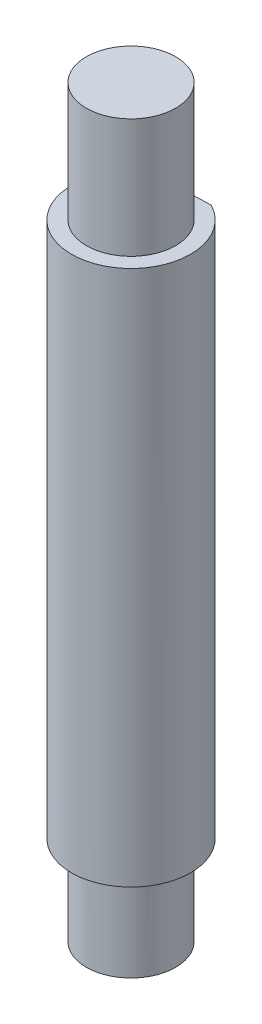
ISO-10303-21;
HEADER;
FILE_DESCRIPTION(('STEP AP214'),'2;1');
FILE_NAME('part.step','',(''),(''),'','','');
FILE_SCHEMA(('AUTOMOTIVE_DESIGN { 1 0 10303 214 1 1 1 1 }'));
ENDSEC;
DATA;
#1=APPLICATION_CONTEXT('core data for automotive mechanical design processes');
#2=APPLICATION_PROTOCOL_DEFINITION('international standard','automotive_design',2000,#1);
#3=PRODUCT_CONTEXT('',#1,'mechanical');
#4=PRODUCT('Part','Part','',(#3));
#5=PRODUCT_RELATED_PRODUCT_CATEGORY('part','',(#4));
#6=PRODUCT_DEFINITION_FORMATION('','',#4);
#7=PRODUCT_DEFINITION_CONTEXT('part definition',#1,'design');
#8=PRODUCT_DEFINITION('design','',#6,#7);
#9=PRODUCT_DEFINITION_SHAPE('','',#8);
#10=(LENGTH_UNIT() NAMED_UNIT(*) SI_UNIT(.MILLI.,.METRE.));
#11=(NAMED_UNIT(*) PLANE_ANGLE_UNIT() SI_UNIT($,.RADIAN.));
#12=(NAMED_UNIT(*) SI_UNIT($,.STERADIAN.) SOLID_ANGLE_UNIT());
#13=UNCERTAINTY_MEASURE_WITH_UNIT(LENGTH_MEASURE(1.E-05),#10,'distance_accuracy_value','');
#14=(GEOMETRIC_REPRESENTATION_CONTEXT(3) GLOBAL_UNCERTAINTY_ASSIGNED_CONTEXT((#13)) GLOBAL_UNIT_ASSIGNED_CONTEXT((#10,
#11,#12)) REPRESENTATION_CONTEXT('',''));
#15=CARTESIAN_POINT('',(0.,0.,0.));
#16=DIRECTION('',(0.,0.,1.));
#17=DIRECTION('',(1.,0.,0.));
#18=AXIS2_PLACEMENT_3D('',#15,#16,#17);
#19=CARTESIAN_POINT('',(0.,18.,0.));
#20=DIRECTION('',(0.,-1.,0.));
#21=DIRECTION('',(0.,0.,-1.));
#22=AXIS2_PLACEMENT_3D('',#19,#20,#21);
#23=PLANE('',#22);
#24=DIRECTION('',(-0.99954088962964,0.,0.0302986791525441));
#25=VECTOR('',#24,1.);
#26=CARTESIAN_POINT('',(0.916253010313562,18.,-1.77777400731683));
#27=LINE('',#26,#25);
#28=CARTESIAN_POINT('',(0.916253010313562,18.,-1.77777400731683));
#29=VERTEX_POINT('',#28);
#30=CARTESIAN_POINT('',(-1.02224970081514,18.,-1.71901295782881));
#31=VERTEX_POINT('',#30);
#32=EDGE_CURVE('E67',#29,#31,#27,.T.);
#33=ORIENTED_EDGE('',*,*,#32,.F.);
#34=CARTESIAN_POINT('',(0.,18.,0.));
#35=DIRECTION('',(0.,-1.,0.));
#36=DIRECTION('',(0.,0.,-1.));
#37=AXIS2_PLACEMENT_3D('',#34,#35,#36);
#38=CIRCLE('',#37,2.);
#39=EDGE_CURVE('E72',#31,#29,#38,.T.);
#40=ORIENTED_EDGE('',*,*,#39,.F.);
#41=EDGE_LOOP('',(#33,#40));
#42=FACE_BOUND('',#41,.T.);
#43=ADVANCED_FACE('F35',(#42),#23,.F.);
#44=CARTESIAN_POINT('',(0.,25.,0.));
#45=DIRECTION('',(0.,-1.,0.));
#46=DIRECTION('',(0.,0.,-1.));
#47=AXIS2_PLACEMENT_3D('',#44,#45,#46);
#48=CYLINDRICAL_SURFACE('',#47,1.5);
#49=CARTESIAN_POINT('',(0.,3.,0.));
#50=DIRECTION('',(0.,-1.,0.));
#51=DIRECTION('',(0.,0.,-1.));
#52=AXIS2_PLACEMENT_3D('',#49,#50,#51);
#53=CIRCLE('',#52,1.5);
#54=CARTESIAN_POINT('',(0.,3.,-1.5));
#55=VERTEX_POINT('',#54);
#56=EDGE_CURVE('E69',#55,#55,#53,.T.);
#57=ORIENTED_EDGE('',*,*,#56,.T.);
#58=EDGE_LOOP('',(#57));
#59=FACE_BOUND('',#58,.T.);
#60=CARTESIAN_POINT('',(0.,0.,0.));
#61=DIRECTION('',(0.,1.,0.));
#62=DIRECTION('',(0.,0.,1.));
#63=AXIS2_PLACEMENT_3D('',#60,#61,#62);
#64=CIRCLE('',#63,1.5);
#65=CARTESIAN_POINT('',(0.,0.,1.5));
#66=VERTEX_POINT('',#65);
#67=EDGE_CURVE('E39',#66,#66,#64,.T.);
#68=ORIENTED_EDGE('',*,*,#67,.T.);
#69=EDGE_LOOP('',(#68));
#70=FACE_BOUND('',#69,.T.);
#71=ADVANCED_FACE('F37',(#59,#70),#48,.T.);
#72=CARTESIAN_POINT('',(0.,0.,0.));
#73=DIRECTION('',(0.,1.,0.));
#74=DIRECTION('',(0.,0.,1.));
#75=AXIS2_PLACEMENT_3D('',#72,#73,#74);
#76=PLANE('',#75);
#77=ORIENTED_EDGE('',*,*,#67,.F.);
#78=EDGE_LOOP('',(#77));
#79=FACE_BOUND('',#78,.T.);
#80=ADVANCED_FACE('F110',(#79),#76,.F.);
#81=CARTESIAN_POINT('',(0.,3.,0.));
#82=DIRECTION('',(0.,-1.,0.));
#83=DIRECTION('',(0.,0.,-1.));
#84=AXIS2_PLACEMENT_3D('',#81,#82,#83);
#85=PLANE('',#84);
#86=CARTESIAN_POINT('',(0.,3.,0.));
#87=DIRECTION('',(0.,-1.,0.));
#88=DIRECTION('',(0.,0.,-1.));
#89=AXIS2_PLACEMENT_3D('',#86,#87,#88);
#90=CIRCLE('',#89,2.);
#91=CARTESIAN_POINT('',(0.,3.,-2.));
#92=VERTEX_POINT('',#91);
#93=EDGE_CURVE('E77',#92,#92,#90,.T.);
#94=ORIENTED_EDGE('',*,*,#93,.T.);
#95=EDGE_LOOP('',(#94));
#96=FACE_BOUND('',#95,.T.);
#97=ORIENTED_EDGE('',*,*,#56,.F.);
#98=EDGE_LOOP('',(#97));
#99=FACE_BOUND('',#98,.T.);
#100=ADVANCED_FACE('F102',(#96,#99),#85,.T.);
#101=CARTESIAN_POINT('',(0.,3.,0.));
#102=DIRECTION('',(0.,1.,0.));
#103=DIRECTION('',(0.,0.,1.));
#104=AXIS2_PLACEMENT_3D('',#101,#102,#103);
#105=CYLINDRICAL_SURFACE('',#104,2.);
#106=ORIENTED_EDGE('',*,*,#93,.F.);
#107=EDGE_LOOP('',(#106));
#108=FACE_BOUND('',#107,.T.);
#109=ORIENTED_EDGE('',*,*,#39,.T.);
#110=DIRECTION('',(0.,-1.,0.));
#111=VECTOR('',#110,1.);
#112=CARTESIAN_POINT('',(0.916253010313562,21.,-1.77777400731683));
#113=LINE('',#112,#111);
#114=CARTESIAN_POINT('',(0.916253010313562,21.,-1.77777400731683));
#115=VERTEX_POINT('',#114);
#116=EDGE_CURVE('E64',#115,#29,#113,.T.);
#117=ORIENTED_EDGE('',*,*,#116,.F.);
#118=CARTESIAN_POINT('',(0.,21.,0.));
#119=DIRECTION('',(0.,1.,0.));
#120=DIRECTION('',(0.,0.,1.));
#121=AXIS2_PLACEMENT_3D('',#118,#119,#120);
#122=CIRCLE('',#121,2.);
#123=CARTESIAN_POINT('',(-1.02224970081514,21.,-1.71901295782881));
#124=VERTEX_POINT('',#123);
#125=EDGE_CURVE('E73',#124,#115,#122,.T.);
#126=ORIENTED_EDGE('',*,*,#125,.F.);
#127=DIRECTION('',(0.,-1.,0.));
#128=VECTOR('',#127,1.);
#129=CARTESIAN_POINT('',(-1.02224970081514,21.,-1.71901295782881));
#130=LINE('',#129,#128);
#131=EDGE_CURVE('E50',#124,#31,#130,.T.);
#132=ORIENTED_EDGE('',*,*,#131,.T.);
#133=EDGE_LOOP('',(#109,#117,#126,#132));
#134=FACE_BOUND('',#133,.T.);
#135=ADVANCED_FACE('F76',(#108,#134),#105,.T.);
#136=CARTESIAN_POINT('',(0.,21.,0.));
#137=DIRECTION('',(0.,1.,0.));
#138=DIRECTION('',(0.,0.,1.));
#139=AXIS2_PLACEMENT_3D('',#136,#137,#138);
#140=PLANE('',#139);
#141=ORIENTED_EDGE('',*,*,#125,.T.);
#142=DIRECTION('',(-0.99954088962964,0.,0.0302986791525441));
#143=VECTOR('',#142,1.);
#144=CARTESIAN_POINT('',(0.916253010313562,21.,-1.77777400731683));
#145=LINE('',#144,#143);
#146=EDGE_CURVE('E58',#115,#124,#145,.T.);
#147=ORIENTED_EDGE('',*,*,#146,.T.);
#148=EDGE_LOOP('',(#141,#147));
#149=FACE_BOUND('',#148,.T.);
#150=CARTESIAN_POINT('',(0.,21.,0.));
#151=DIRECTION('',(0.,1.,0.));
#152=DIRECTION('',(0.,0.,1.));
#153=AXIS2_PLACEMENT_3D('',#150,#151,#152);
#154=CIRCLE('',#153,1.5);
#155=CARTESIAN_POINT('',(0.,21.,1.5));
#156=VERTEX_POINT('',#155);
#157=EDGE_CURVE('E74',#156,#156,#154,.T.);
#158=ORIENTED_EDGE('',*,*,#157,.F.);
#159=EDGE_LOOP('',(#158));
#160=FACE_BOUND('',#159,.T.);
#161=ADVANCED_FACE('F93',(#149,#160),#140,.T.);
#162=CARTESIAN_POINT('',(0.916253010313562,21.,-1.77777400731683));
#163=DIRECTION('',(0.0302986791525441,0.,0.999540889629639));
#164=DIRECTION('',(0.99954088962964,0.,-0.0302986791525441));
#165=AXIS2_PLACEMENT_3D('',#162,#163,#164);
#166=PLANE('',#165);
#167=ORIENTED_EDGE('',*,*,#32,.T.);
#168=ORIENTED_EDGE('',*,*,#131,.F.);
#169=ORIENTED_EDGE('',*,*,#146,.F.);
#170=ORIENTED_EDGE('',*,*,#116,.T.);
#171=EDGE_LOOP('',(#167,#168,#169,#170));
#172=FACE_BOUND('',#171,.T.);
#173=ADVANCED_FACE('F66',(#172),#166,.F.);
#174=CARTESIAN_POINT('',(0.,25.,0.));
#175=DIRECTION('',(0.,1.,0.));
#176=DIRECTION('',(0.,0.,1.));
#177=AXIS2_PLACEMENT_3D('',#174,#175,#176);
#178=PLANE('',#177);
#179=CARTESIAN_POINT('',(0.,25.,0.));
#180=DIRECTION('',(0.,1.,0.));
#181=DIRECTION('',(0.,0.,1.));
#182=AXIS2_PLACEMENT_3D('',#179,#180,#181);
#183=CIRCLE('',#182,1.5);
#184=CARTESIAN_POINT('',(0.,25.,1.5));
#185=VERTEX_POINT('',#184);
#186=EDGE_CURVE('E11',#185,#185,#183,.T.);
#187=ORIENTED_EDGE('',*,*,#186,.T.);
#188=EDGE_LOOP('',(#187));
#189=FACE_BOUND('',#188,.T.);
#190=ADVANCED_FACE('F100',(#189),#178,.T.);
#191=ORIENTED_EDGE('',*,*,#157,.T.);
#192=EDGE_LOOP('',(#191));
#193=FACE_BOUND('',#192,.T.);
#194=ORIENTED_EDGE('',*,*,#186,.F.);
#195=EDGE_LOOP('',(#194));
#196=FACE_BOUND('',#195,.T.);
#197=ADVANCED_FACE('F90',(#193,#196),#48,.T.);
#198=CLOSED_SHELL('',(#43,#71,#80,#100,#135,#161,#173,#190,#197));
#199=MANIFOLD_SOLID_BREP('B2',#198);
#200=ADVANCED_BREP_SHAPE_REPRESENTATION('',(#18,#199),#14);
#201=SHAPE_DEFINITION_REPRESENTATION(#9,#200);
ENDSEC;
END-ISO-10303-21;
